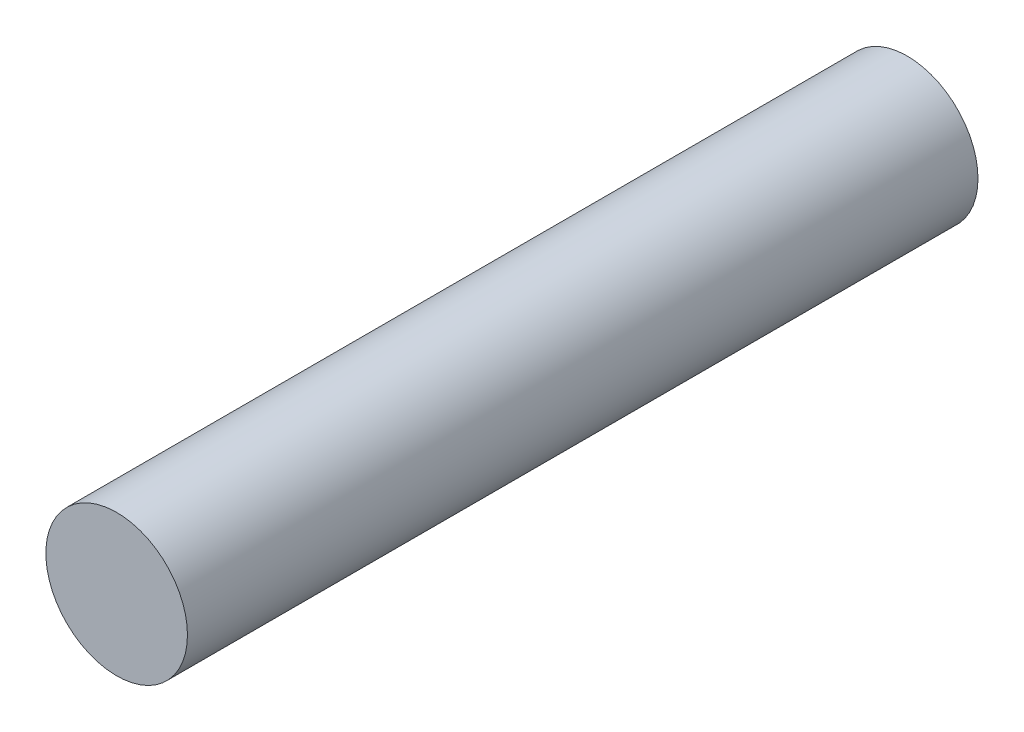
ISO-10303-21;
HEADER;
FILE_DESCRIPTION(('STEP AP214'),'2;1');
FILE_NAME('part.step','',(''),(''),'','','');
FILE_SCHEMA(('AUTOMOTIVE_DESIGN { 1 0 10303 214 1 1 1 1 }'));
ENDSEC;
DATA;
#1=APPLICATION_CONTEXT('core data for automotive mechanical design processes');
#2=APPLICATION_PROTOCOL_DEFINITION('international standard','automotive_design',2000,#1);
#3=PRODUCT_CONTEXT('',#1,'mechanical');
#4=PRODUCT('Part','Part','',(#3));
#5=PRODUCT_RELATED_PRODUCT_CATEGORY('part','',(#4));
#6=PRODUCT_DEFINITION_FORMATION('','',#4);
#7=PRODUCT_DEFINITION_CONTEXT('part definition',#1,'design');
#8=PRODUCT_DEFINITION('design','',#6,#7);
#9=PRODUCT_DEFINITION_SHAPE('','',#8);
#10=(LENGTH_UNIT() NAMED_UNIT(*) SI_UNIT(.MILLI.,.METRE.));
#11=(NAMED_UNIT(*) PLANE_ANGLE_UNIT() SI_UNIT($,.RADIAN.));
#12=(NAMED_UNIT(*) SI_UNIT($,.STERADIAN.) SOLID_ANGLE_UNIT());
#13=UNCERTAINTY_MEASURE_WITH_UNIT(LENGTH_MEASURE(1.E-05),#10,'distance_accuracy_value','');
#14=(GEOMETRIC_REPRESENTATION_CONTEXT(3) GLOBAL_UNCERTAINTY_ASSIGNED_CONTEXT((#13)) GLOBAL_UNIT_ASSIGNED_CONTEXT((#10,
#11,#12)) REPRESENTATION_CONTEXT('',''));
#15=CARTESIAN_POINT('',(0.,0.,0.));
#16=DIRECTION('',(0.,0.,1.));
#17=DIRECTION('',(1.,0.,0.));
#18=AXIS2_PLACEMENT_3D('',#15,#16,#17);
#19=CARTESIAN_POINT('',(0.,0.,67.));
#20=DIRECTION('',(0.,0.,-1.));
#21=DIRECTION('',(-1.,0.,0.));
#22=AXIS2_PLACEMENT_3D('',#19,#20,#21);
#23=CYLINDRICAL_SURFACE('',#22,6.);
#24=CARTESIAN_POINT('',(0.,0.,67.));
#25=DIRECTION('',(0.,0.,1.));
#26=DIRECTION('',(1.,0.,0.));
#27=AXIS2_PLACEMENT_3D('',#24,#25,#26);
#28=CIRCLE('',#27,6.);
#29=CARTESIAN_POINT('',(6.,0.,67.));
#30=VERTEX_POINT('',#29);
#31=EDGE_CURVE('E10',#30,#30,#28,.T.);
#32=ORIENTED_EDGE('',*,*,#31,.F.);
#33=EDGE_LOOP('',(#32));
#34=FACE_BOUND('',#33,.T.);
#35=CARTESIAN_POINT('',(0.,0.,0.));
#36=DIRECTION('',(0.,0.,1.));
#37=DIRECTION('',(1.,0.,0.));
#38=AXIS2_PLACEMENT_3D('',#35,#36,#37);
#39=CIRCLE('',#38,6.);
#40=CARTESIAN_POINT('',(6.,0.,0.));
#41=VERTEX_POINT('',#40);
#42=EDGE_CURVE('E40',#41,#41,#39,.T.);
#43=ORIENTED_EDGE('',*,*,#42,.T.);
#44=EDGE_LOOP('',(#43));
#45=FACE_BOUND('',#44,.T.);
#46=ADVANCED_FACE('F37',(#34,#45),#23,.T.);
#47=CARTESIAN_POINT('',(0.,0.,67.));
#48=DIRECTION('',(0.,0.,1.));
#49=DIRECTION('',(1.,0.,0.));
#50=AXIS2_PLACEMENT_3D('',#47,#48,#49);
#51=PLANE('',#50);
#52=ORIENTED_EDGE('',*,*,#31,.T.);
#53=EDGE_LOOP('',(#52));
#54=FACE_BOUND('',#53,.T.);
#55=ADVANCED_FACE('F54',(#54),#51,.T.);
#56=CARTESIAN_POINT('',(0.,0.,0.));
#57=DIRECTION('',(0.,0.,1.));
#58=DIRECTION('',(1.,0.,0.));
#59=AXIS2_PLACEMENT_3D('',#56,#57,#58);
#60=PLANE('',#59);
#61=ORIENTED_EDGE('',*,*,#42,.F.);
#62=EDGE_LOOP('',(#61));
#63=FACE_BOUND('',#62,.T.);
#64=ADVANCED_FACE('F52',(#63),#60,.F.);
#65=CLOSED_SHELL('',(#46,#55,#64));
#66=MANIFOLD_SOLID_BREP('B2',#65);
#67=ADVANCED_BREP_SHAPE_REPRESENTATION('',(#18,#66),#14);
#68=SHAPE_DEFINITION_REPRESENTATION(#9,#67);
ENDSEC;
END-ISO-10303-21;
